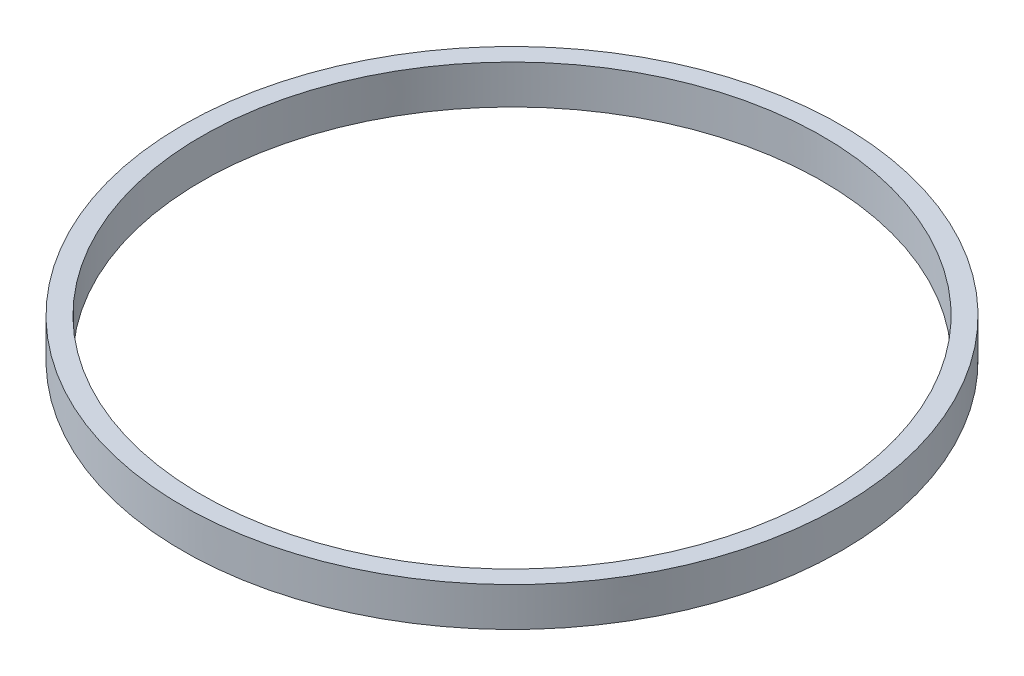
ISO-10303-21;
HEADER;
FILE_DESCRIPTION(('STEP AP214'),'2;1');
FILE_NAME('part.step','',(''),(''),'','','');
FILE_SCHEMA(('AUTOMOTIVE_DESIGN { 1 0 10303 214 1 1 1 1 }'));
ENDSEC;
DATA;
#1=APPLICATION_CONTEXT('core data for automotive mechanical design processes');
#2=APPLICATION_PROTOCOL_DEFINITION('international standard','automotive_design',2000,#1);
#3=PRODUCT_CONTEXT('',#1,'mechanical');
#4=PRODUCT('Part','Part','',(#3));
#5=PRODUCT_RELATED_PRODUCT_CATEGORY('part','',(#4));
#6=PRODUCT_DEFINITION_FORMATION('','',#4);
#7=PRODUCT_DEFINITION_CONTEXT('part definition',#1,'design');
#8=PRODUCT_DEFINITION('design','',#6,#7);
#9=PRODUCT_DEFINITION_SHAPE('','',#8);
#10=(LENGTH_UNIT() NAMED_UNIT(*) SI_UNIT(.MILLI.,.METRE.));
#11=(NAMED_UNIT(*) PLANE_ANGLE_UNIT() SI_UNIT($,.RADIAN.));
#12=(NAMED_UNIT(*) SI_UNIT($,.STERADIAN.) SOLID_ANGLE_UNIT());
#13=UNCERTAINTY_MEASURE_WITH_UNIT(LENGTH_MEASURE(1.E-05),#10,'distance_accuracy_value','');
#14=(GEOMETRIC_REPRESENTATION_CONTEXT(3) GLOBAL_UNCERTAINTY_ASSIGNED_CONTEXT((#13)) GLOBAL_UNIT_ASSIGNED_CONTEXT((#10,
#11,#12)) REPRESENTATION_CONTEXT('',''));
#15=CARTESIAN_POINT('',(0.,0.,0.));
#16=DIRECTION('',(0.,0.,1.));
#17=DIRECTION('',(1.,0.,0.));
#18=AXIS2_PLACEMENT_3D('',#15,#16,#17);
#19=CARTESIAN_POINT('',(0.,0.,0.));
#20=DIRECTION('',(-4.88883233497212E-05,0.999999998804966,0.));
#21=DIRECTION('',(-0.999999998804966,-4.88883233497212E-05,0.));
#22=AXIS2_PLACEMENT_3D('',#19,#20,#21);
#23=CONICAL_SURFACE('',#22,16.2411262373997,1.57074743847151);
#24=CARTESIAN_POINT('',(-2.38071768815402E-09,4.86970614287297E-05,0.));
#25=DIRECTION('',(4.88883233497212E-05,-0.999999998804966,0.));
#26=DIRECTION('',(0.999999998804966,4.88883233497212E-05,0.));
#27=AXIS2_PLACEMENT_3D('',#24,#25,#26);
#28=CIRCLE('',#27,17.2372140169901);
#29=CARTESIAN_POINT('',(17.2372139940103,0.000891395553939689,0.));
#30=VERTEX_POINT('',#29);
#31=EDGE_CURVE('E10',#30,#30,#28,.T.);
#32=ORIENTED_EDGE('',*,*,#31,.T.);
#33=EDGE_LOOP('',(#32));
#34=FACE_BOUND('',#33,.T.);
#35=CARTESIAN_POINT('',(0.,0.,0.));
#36=DIRECTION('',(4.88883233497212E-05,-0.999999998804966,0.));
#37=DIRECTION('',(0.999999998804966,4.88883233497212E-05,0.));
#38=AXIS2_PLACEMENT_3D('',#35,#36,#37);
#39=CIRCLE('',#38,16.2411262373997);
#40=CARTESIAN_POINT('',(16.241126217991,0.000794001431020374,0.));
#41=VERTEX_POINT('',#40);
#42=EDGE_CURVE('E44',#41,#41,#39,.T.);
#43=ORIENTED_EDGE('',*,*,#42,.F.);
#44=EDGE_LOOP('',(#43));
#45=FACE_BOUND('',#44,.T.);
#46=ADVANCED_FACE('F30',(#34,#45),#23,.T.);
#47=CARTESIAN_POINT('',(-2.38071768815402E-09,4.86970614287297E-05,0.));
#48=DIRECTION('',(4.88883233497212E-05,-0.999999998804966,0.));
#49=DIRECTION('',(0.999999998804966,4.88883233497212E-05,0.));
#50=AXIS2_PLACEMENT_3D('',#47,#48,#49);
#51=CONICAL_SURFACE('',#50,17.2372140169901,4.88883233654842E-05);
#52=CARTESIAN_POINT('',(-9.95444620068221E-05,2.03616027442329,0.));
#53=DIRECTION('',(4.88883233497212E-05,-0.999999998804966,0.));
#54=DIRECTION('',(0.999999998804966,4.88883233497212E-05,0.));
#55=AXIS2_PLACEMENT_3D('',#52,#53,#54);
#56=CIRCLE('',#55,17.2371144749087);
#57=CARTESIAN_POINT('',(17.2370149098478,2.03700296804936,0.));
#58=VERTEX_POINT('',#57);
#59=EDGE_CURVE('E36',#58,#58,#56,.T.);
#60=ORIENTED_EDGE('',*,*,#59,.T.);
#61=EDGE_LOOP('',(#60));
#62=FACE_BOUND('',#61,.T.);
#63=ORIENTED_EDGE('',*,*,#31,.F.);
#64=EDGE_LOOP('',(#63));
#65=FACE_BOUND('',#64,.T.);
#66=ADVANCED_FACE('F54',(#62,#65),#51,.T.);
#67=CARTESIAN_POINT('',(-9.95444620068221E-05,2.03616027442329,0.));
#68=DIRECTION('',(-4.88883233497212E-05,0.999999998804966,0.));
#69=DIRECTION('',(-0.999999998804966,-4.88883233497212E-05,0.));
#70=AXIS2_PLACEMENT_3D('',#67,#68,#69);
#71=CONICAL_SURFACE('',#70,17.2371144749087,1.57074743847086);
#72=CARTESIAN_POINT('',(-9.95420812890999E-05,2.03611157736117,0.));
#73=DIRECTION('',(4.88883233497212E-05,-0.999999998804966,0.));
#74=DIRECTION('',(0.999999998804966,4.88883233497212E-05,0.));
#75=AXIS2_PLACEMENT_3D('',#72,#73,#74);
#76=CIRCLE('',#75,16.2410266951926);
#77=CARTESIAN_POINT('',(16.2409271337027,2.03690557392577,0.));
#78=VERTEX_POINT('',#77);
#79=EDGE_CURVE('E40',#78,#78,#76,.T.);
#80=ORIENTED_EDGE('',*,*,#79,.T.);
#81=EDGE_LOOP('',(#80));
#82=FACE_BOUND('',#81,.T.);
#83=ORIENTED_EDGE('',*,*,#59,.F.);
#84=EDGE_LOOP('',(#83));
#85=FACE_BOUND('',#84,.T.);
#86=ADVANCED_FACE('F58',(#82,#85),#71,.F.);
#87=CARTESIAN_POINT('',(-9.95420812890999E-05,2.03611157736117,0.));
#88=DIRECTION('',(4.88883233497212E-05,-0.999999998804966,0.));
#89=DIRECTION('',(0.999999998804966,4.88883233497212E-05,0.));
#90=AXIS2_PLACEMENT_3D('',#87,#88,#89);
#91=CONICAL_SURFACE('',#90,16.2410266951926,4.88883851083884E-05);
#92=ORIENTED_EDGE('',*,*,#42,.T.);
#93=EDGE_LOOP('',(#92));
#94=FACE_BOUND('',#93,.T.);
#95=ORIENTED_EDGE('',*,*,#79,.F.);
#96=EDGE_LOOP('',(#95));
#97=FACE_BOUND('',#96,.T.);
#98=ADVANCED_FACE('F50',(#94,#97),#91,.F.);
#99=CLOSED_SHELL('',(#46,#66,#86,#98));
#100=MANIFOLD_SOLID_BREP('B2',#99);
#101=ADVANCED_BREP_SHAPE_REPRESENTATION('',(#18,#100),#14);
#102=SHAPE_DEFINITION_REPRESENTATION(#9,#101);
ENDSEC;
END-ISO-10303-21;
